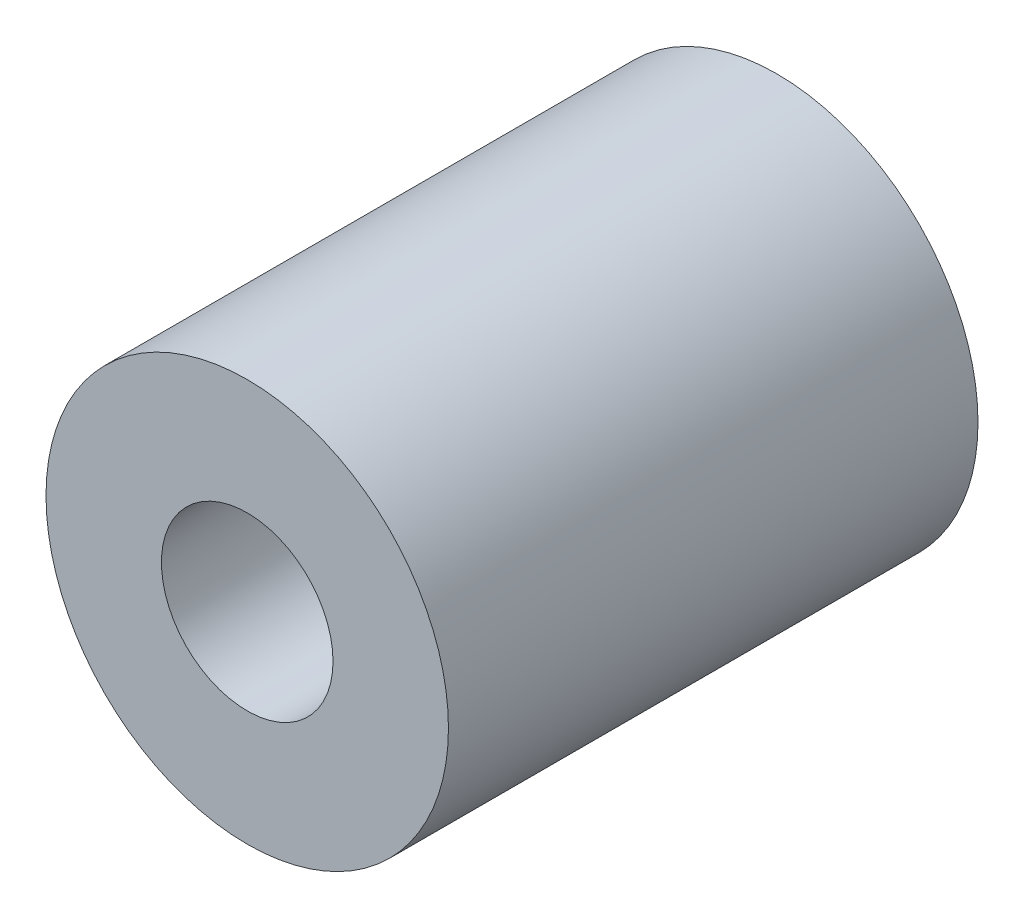
ISO-10303-21;
HEADER;
FILE_DESCRIPTION(('STEP AP214'),'2;1');
FILE_NAME('part.step','',(''),(''),'','','');
FILE_SCHEMA(('AUTOMOTIVE_DESIGN { 1 0 10303 214 1 1 1 1 }'));
ENDSEC;
DATA;
#1=APPLICATION_CONTEXT('core data for automotive mechanical design processes');
#2=APPLICATION_PROTOCOL_DEFINITION('international standard','automotive_design',2000,#1);
#3=PRODUCT_CONTEXT('',#1,'mechanical');
#4=PRODUCT('Part','Part','',(#3));
#5=PRODUCT_RELATED_PRODUCT_CATEGORY('part','',(#4));
#6=PRODUCT_DEFINITION_FORMATION('','',#4);
#7=PRODUCT_DEFINITION_CONTEXT('part definition',#1,'design');
#8=PRODUCT_DEFINITION('design','',#6,#7);
#9=PRODUCT_DEFINITION_SHAPE('','',#8);
#10=(LENGTH_UNIT() NAMED_UNIT(*) SI_UNIT(.MILLI.,.METRE.));
#11=(NAMED_UNIT(*) PLANE_ANGLE_UNIT() SI_UNIT($,.RADIAN.));
#12=(NAMED_UNIT(*) SI_UNIT($,.STERADIAN.) SOLID_ANGLE_UNIT());
#13=UNCERTAINTY_MEASURE_WITH_UNIT(LENGTH_MEASURE(1.E-05),#10,'distance_accuracy_value','');
#14=(GEOMETRIC_REPRESENTATION_CONTEXT(3) GLOBAL_UNCERTAINTY_ASSIGNED_CONTEXT((#13)) GLOBAL_UNIT_ASSIGNED_CONTEXT((#10,
#11,#12)) REPRESENTATION_CONTEXT('',''));
#15=CARTESIAN_POINT('',(0.,0.,0.));
#16=DIRECTION('',(0.,0.,1.));
#17=DIRECTION('',(1.,0.,0.));
#18=AXIS2_PLACEMENT_3D('',#15,#16,#17);
#19=CARTESIAN_POINT('',(0.,0.,25.));
#20=DIRECTION('',(0.,0.,-1.));
#21=DIRECTION('',(-1.,0.,0.));
#22=AXIS2_PLACEMENT_3D('',#19,#20,#21);
#23=CYLINDRICAL_SURFACE('',#22,9.5);
#24=CARTESIAN_POINT('',(0.,0.,25.));
#25=DIRECTION('',(0.,0.,1.));
#26=DIRECTION('',(1.,0.,0.));
#27=AXIS2_PLACEMENT_3D('',#24,#25,#26);
#28=CIRCLE('',#27,9.5);
#29=CARTESIAN_POINT('',(9.5,0.,25.));
#30=VERTEX_POINT('',#29);
#31=EDGE_CURVE('E10',#30,#30,#28,.T.);
#32=ORIENTED_EDGE('',*,*,#31,.F.);
#33=EDGE_LOOP('',(#32));
#34=FACE_BOUND('',#33,.T.);
#35=CARTESIAN_POINT('',(0.,0.,0.));
#36=DIRECTION('',(0.,0.,1.));
#37=DIRECTION('',(1.,0.,0.));
#38=AXIS2_PLACEMENT_3D('',#35,#36,#37);
#39=CIRCLE('',#38,9.5);
#40=CARTESIAN_POINT('',(9.5,0.,0.));
#41=VERTEX_POINT('',#40);
#42=EDGE_CURVE('E40',#41,#41,#39,.T.);
#43=ORIENTED_EDGE('',*,*,#42,.T.);
#44=EDGE_LOOP('',(#43));
#45=FACE_BOUND('',#44,.T.);
#46=ADVANCED_FACE('F37',(#34,#45),#23,.T.);
#47=CARTESIAN_POINT('',(0.,0.,25.));
#48=DIRECTION('',(0.,0.,1.));
#49=DIRECTION('',(1.,0.,0.));
#50=AXIS2_PLACEMENT_3D('',#47,#48,#49);
#51=PLANE('',#50);
#52=CARTESIAN_POINT('',(0.,0.,25.));
#53=DIRECTION('',(0.,0.,1.));
#54=DIRECTION('',(1.,0.,0.));
#55=AXIS2_PLACEMENT_3D('',#52,#53,#54);
#56=CIRCLE('',#55,4.05);
#57=CARTESIAN_POINT('',(4.05,0.,25.));
#58=VERTEX_POINT('',#57);
#59=EDGE_CURVE('E49',#58,#58,#56,.T.);
#60=ORIENTED_EDGE('',*,*,#59,.F.);
#61=EDGE_LOOP('',(#60));
#62=FACE_BOUND('',#61,.T.);
#63=ORIENTED_EDGE('',*,*,#31,.T.);
#64=EDGE_LOOP('',(#63));
#65=FACE_BOUND('',#64,.T.);
#66=ADVANCED_FACE('F64',(#62,#65),#51,.T.);
#67=CARTESIAN_POINT('',(0.,0.,0.));
#68=DIRECTION('',(0.,0.,1.));
#69=DIRECTION('',(1.,0.,0.));
#70=AXIS2_PLACEMENT_3D('',#67,#68,#69);
#71=PLANE('',#70);
#72=CARTESIAN_POINT('',(0.,0.,0.));
#73=DIRECTION('',(0.,0.,1.));
#74=DIRECTION('',(1.,0.,0.));
#75=AXIS2_PLACEMENT_3D('',#72,#73,#74);
#76=CIRCLE('',#75,4.05);
#77=CARTESIAN_POINT('',(4.05,0.,0.));
#78=VERTEX_POINT('',#77);
#79=EDGE_CURVE('E47',#78,#78,#76,.T.);
#80=ORIENTED_EDGE('',*,*,#79,.T.);
#81=EDGE_LOOP('',(#80));
#82=FACE_BOUND('',#81,.T.);
#83=ORIENTED_EDGE('',*,*,#42,.F.);
#84=EDGE_LOOP('',(#83));
#85=FACE_BOUND('',#84,.T.);
#86=ADVANCED_FACE('F55',(#82,#85),#71,.F.);
#87=CARTESIAN_POINT('',(0.,0.,0.));
#88=DIRECTION('',(0.,0.,1.));
#89=DIRECTION('',(1.,0.,0.));
#90=AXIS2_PLACEMENT_3D('',#87,#88,#89);
#91=CYLINDRICAL_SURFACE('',#90,4.05);
#92=ORIENTED_EDGE('',*,*,#79,.F.);
#93=EDGE_LOOP('',(#92));
#94=FACE_BOUND('',#93,.T.);
#95=ORIENTED_EDGE('',*,*,#59,.T.);
#96=EDGE_LOOP('',(#95));
#97=FACE_BOUND('',#96,.T.);
#98=ADVANCED_FACE('F58',(#94,#97),#91,.F.);
#99=CLOSED_SHELL('',(#46,#66,#86,#98));
#100=MANIFOLD_SOLID_BREP('B2',#99);
#101=ADVANCED_BREP_SHAPE_REPRESENTATION('',(#18,#100),#14);
#102=SHAPE_DEFINITION_REPRESENTATION(#9,#101);
ENDSEC;
END-ISO-10303-21;
